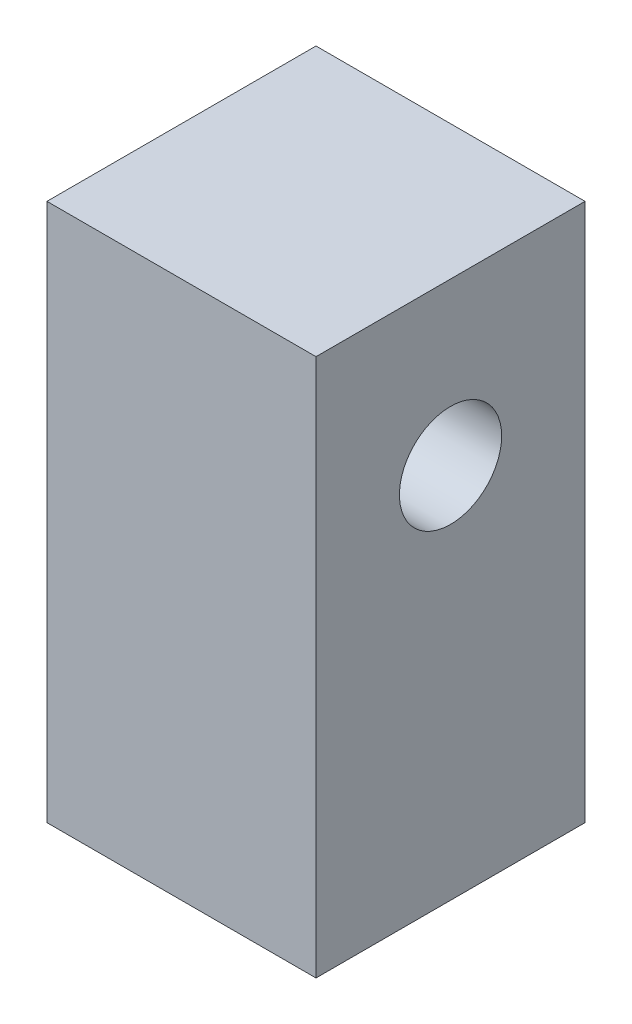
ISO-10303-21;
HEADER;
FILE_DESCRIPTION(('STEP AP214'),'2;1');
FILE_NAME('part.step','',(''),(''),'','','');
FILE_SCHEMA(('AUTOMOTIVE_DESIGN { 1 0 10303 214 1 1 1 1 }'));
ENDSEC;
DATA;
#1=APPLICATION_CONTEXT('core data for automotive mechanical design processes');
#2=APPLICATION_PROTOCOL_DEFINITION('international standard','automotive_design',2000,#1);
#3=PRODUCT_CONTEXT('',#1,'mechanical');
#4=PRODUCT('Part','Part','',(#3));
#5=PRODUCT_RELATED_PRODUCT_CATEGORY('part','',(#4));
#6=PRODUCT_DEFINITION_FORMATION('','',#4);
#7=PRODUCT_DEFINITION_CONTEXT('part definition',#1,'design');
#8=PRODUCT_DEFINITION('design','',#6,#7);
#9=PRODUCT_DEFINITION_SHAPE('','',#8);
#10=(LENGTH_UNIT() NAMED_UNIT(*) SI_UNIT(.MILLI.,.METRE.));
#11=(NAMED_UNIT(*) PLANE_ANGLE_UNIT() SI_UNIT($,.RADIAN.));
#12=(NAMED_UNIT(*) SI_UNIT($,.STERADIAN.) SOLID_ANGLE_UNIT());
#13=UNCERTAINTY_MEASURE_WITH_UNIT(LENGTH_MEASURE(1.E-05),#10,'distance_accuracy_value','');
#14=(GEOMETRIC_REPRESENTATION_CONTEXT(3) GLOBAL_UNCERTAINTY_ASSIGNED_CONTEXT((#13)) GLOBAL_UNIT_ASSIGNED_CONTEXT((#10,
#11,#12)) REPRESENTATION_CONTEXT('',''));
#15=CARTESIAN_POINT('',(0.,0.,0.));
#16=DIRECTION('',(0.,0.,1.));
#17=DIRECTION('',(1.,0.,0.));
#18=AXIS2_PLACEMENT_3D('',#15,#16,#17);
#19=CARTESIAN_POINT('',(-6.35,25.4,6.35));
#20=DIRECTION('',(1.,0.,0.));
#21=DIRECTION('',(0.,0.,-1.));
#22=AXIS2_PLACEMENT_3D('',#19,#20,#21);
#23=PLANE('',#22);
#24=CARTESIAN_POINT('',(-6.35,17.78,0.));
#25=DIRECTION('',(1.,0.,0.));
#26=DIRECTION('',(0.,0.,-1.));
#27=AXIS2_PLACEMENT_3D('',#24,#25,#26);
#28=CIRCLE('',#27,2.413);
#29=CARTESIAN_POINT('',(-6.35,17.78,-2.413));
#30=VERTEX_POINT('',#29);
#31=EDGE_CURVE('E116',#30,#30,#28,.T.);
#32=ORIENTED_EDGE('',*,*,#31,.T.);
#33=EDGE_LOOP('',(#32));
#34=FACE_BOUND('',#33,.T.);
#35=DIRECTION('',(0.,0.,1.));
#36=VECTOR('',#35,1.);
#37=CARTESIAN_POINT('',(-6.35,0.,6.35));
#38=LINE('',#37,#36);
#39=CARTESIAN_POINT('',(-6.35,0.,-6.35));
#40=VERTEX_POINT('',#39);
#41=CARTESIAN_POINT('',(-6.35,0.,6.35));
#42=VERTEX_POINT('',#41);
#43=EDGE_CURVE('E112',#40,#42,#38,.T.);
#44=ORIENTED_EDGE('',*,*,#43,.T.);
#45=DIRECTION('',(0.,-1.,0.));
#46=VECTOR('',#45,1.);
#47=CARTESIAN_POINT('',(-6.35,25.4,6.35));
#48=LINE('',#47,#46);
#49=CARTESIAN_POINT('',(-6.35,25.4,6.35));
#50=VERTEX_POINT('',#49);
#51=EDGE_CURVE('E11',#50,#42,#48,.T.);
#52=ORIENTED_EDGE('',*,*,#51,.F.);
#53=DIRECTION('',(0.,0.,1.));
#54=VECTOR('',#53,1.);
#55=CARTESIAN_POINT('',(-6.35,25.4,6.35));
#56=LINE('',#55,#54);
#57=CARTESIAN_POINT('',(-6.35,25.4,-6.35));
#58=VERTEX_POINT('',#57);
#59=EDGE_CURVE('E95',#58,#50,#56,.T.);
#60=ORIENTED_EDGE('',*,*,#59,.F.);
#61=DIRECTION('',(0.,-1.,0.));
#62=VECTOR('',#61,1.);
#63=CARTESIAN_POINT('',(-6.35,25.4,-6.35));
#64=LINE('',#63,#62);
#65=EDGE_CURVE('E108',#58,#40,#64,.T.);
#66=ORIENTED_EDGE('',*,*,#65,.T.);
#67=EDGE_LOOP('',(#44,#52,#60,#66));
#68=FACE_BOUND('',#67,.T.);
#69=ADVANCED_FACE('F43',(#34,#68),#23,.F.);
#70=CARTESIAN_POINT('',(6.35,25.4,6.35));
#71=DIRECTION('',(0.,0.,-1.));
#72=DIRECTION('',(-1.,0.,0.));
#73=AXIS2_PLACEMENT_3D('',#70,#71,#72);
#74=PLANE('',#73);
#75=DIRECTION('',(1.,0.,0.));
#76=VECTOR('',#75,1.);
#77=CARTESIAN_POINT('',(6.35,0.,6.35));
#78=LINE('',#77,#76);
#79=CARTESIAN_POINT('',(6.35,0.,6.35));
#80=VERTEX_POINT('',#79);
#81=EDGE_CURVE('E100',#42,#80,#78,.T.);
#82=ORIENTED_EDGE('',*,*,#81,.T.);
#83=DIRECTION('',(0.,-1.,0.));
#84=VECTOR('',#83,1.);
#85=CARTESIAN_POINT('',(6.35,25.4,6.35));
#86=LINE('',#85,#84);
#87=CARTESIAN_POINT('',(6.35,25.4,6.35));
#88=VERTEX_POINT('',#87);
#89=EDGE_CURVE('E52',#88,#80,#86,.T.);
#90=ORIENTED_EDGE('',*,*,#89,.F.);
#91=DIRECTION('',(1.,0.,0.));
#92=VECTOR('',#91,1.);
#93=CARTESIAN_POINT('',(6.35,25.4,6.35));
#94=LINE('',#93,#92);
#95=EDGE_CURVE('E90',#50,#88,#94,.T.);
#96=ORIENTED_EDGE('',*,*,#95,.F.);
#97=ORIENTED_EDGE('',*,*,#51,.T.);
#98=EDGE_LOOP('',(#82,#90,#96,#97));
#99=FACE_BOUND('',#98,.T.);
#100=ADVANCED_FACE('F99',(#99),#74,.F.);
#101=CARTESIAN_POINT('',(6.35,25.4,6.35));
#102=DIRECTION('',(-1.,0.,0.));
#103=DIRECTION('',(0.,0.,1.));
#104=AXIS2_PLACEMENT_3D('',#101,#102,#103);
#105=PLANE('',#104);
#106=CARTESIAN_POINT('',(6.35,17.78,0.));
#107=DIRECTION('',(1.,0.,0.));
#108=DIRECTION('',(0.,0.,-1.));
#109=AXIS2_PLACEMENT_3D('',#106,#107,#108);
#110=CIRCLE('',#109,2.413);
#111=CARTESIAN_POINT('',(6.35,17.78,-2.413));
#112=VERTEX_POINT('',#111);
#113=EDGE_CURVE('E138',#112,#112,#110,.T.);
#114=ORIENTED_EDGE('',*,*,#113,.F.);
#115=EDGE_LOOP('',(#114));
#116=FACE_BOUND('',#115,.T.);
#117=DIRECTION('',(0.,0.,-1.));
#118=VECTOR('',#117,1.);
#119=CARTESIAN_POINT('',(6.35,0.,6.35));
#120=LINE('',#119,#118);
#121=CARTESIAN_POINT('',(6.35,0.,-6.35));
#122=VERTEX_POINT('',#121);
#123=EDGE_CURVE('E77',#80,#122,#120,.T.);
#124=ORIENTED_EDGE('',*,*,#123,.T.);
#125=DIRECTION('',(0.,-1.,0.));
#126=VECTOR('',#125,1.);
#127=CARTESIAN_POINT('',(6.35,25.4,-6.35));
#128=LINE('',#127,#126);
#129=CARTESIAN_POINT('',(6.35,25.4,-6.35));
#130=VERTEX_POINT('',#129);
#131=EDGE_CURVE('E102',#130,#122,#128,.T.);
#132=ORIENTED_EDGE('',*,*,#131,.F.);
#133=DIRECTION('',(0.,0.,-1.));
#134=VECTOR('',#133,1.);
#135=CARTESIAN_POINT('',(6.35,25.4,6.35));
#136=LINE('',#135,#134);
#137=EDGE_CURVE('E93',#88,#130,#136,.T.);
#138=ORIENTED_EDGE('',*,*,#137,.F.);
#139=ORIENTED_EDGE('',*,*,#89,.T.);
#140=EDGE_LOOP('',(#124,#132,#138,#139));
#141=FACE_BOUND('',#140,.T.);
#142=ADVANCED_FACE('F103',(#116,#141),#105,.F.);
#143=CARTESIAN_POINT('',(6.35,25.4,-6.35));
#144=DIRECTION('',(0.,0.,1.));
#145=DIRECTION('',(1.,0.,0.));
#146=AXIS2_PLACEMENT_3D('',#143,#144,#145);
#147=PLANE('',#146);
#148=DIRECTION('',(-1.,0.,0.));
#149=VECTOR('',#148,1.);
#150=CARTESIAN_POINT('',(6.35,0.,-6.35));
#151=LINE('',#150,#149);
#152=EDGE_CURVE('E83',#122,#40,#151,.T.);
#153=ORIENTED_EDGE('',*,*,#152,.T.);
#154=ORIENTED_EDGE('',*,*,#65,.F.);
#155=DIRECTION('',(-1.,0.,0.));
#156=VECTOR('',#155,1.);
#157=CARTESIAN_POINT('',(6.35,25.4,-6.35));
#158=LINE('',#157,#156);
#159=EDGE_CURVE('E60',#130,#58,#158,.T.);
#160=ORIENTED_EDGE('',*,*,#159,.F.);
#161=ORIENTED_EDGE('',*,*,#131,.T.);
#162=EDGE_LOOP('',(#153,#154,#160,#161));
#163=FACE_BOUND('',#162,.T.);
#164=ADVANCED_FACE('F127',(#163),#147,.F.);
#165=CARTESIAN_POINT('',(0.,25.4,0.));
#166=DIRECTION('',(0.,1.,0.));
#167=DIRECTION('',(0.,0.,1.));
#168=AXIS2_PLACEMENT_3D('',#165,#166,#167);
#169=PLANE('',#168);
#170=ORIENTED_EDGE('',*,*,#59,.T.);
#171=ORIENTED_EDGE('',*,*,#95,.T.);
#172=ORIENTED_EDGE('',*,*,#137,.T.);
#173=ORIENTED_EDGE('',*,*,#159,.T.);
#174=EDGE_LOOP('',(#170,#171,#172,#173));
#175=FACE_BOUND('',#174,.T.);
#176=ADVANCED_FACE('F91',(#175),#169,.T.);
#177=CARTESIAN_POINT('',(0.,0.,0.));
#178=DIRECTION('',(0.,1.,0.));
#179=DIRECTION('',(0.,0.,1.));
#180=AXIS2_PLACEMENT_3D('',#177,#178,#179);
#181=PLANE('',#180);
#182=ORIENTED_EDGE('',*,*,#43,.F.);
#183=ORIENTED_EDGE('',*,*,#152,.F.);
#184=ORIENTED_EDGE('',*,*,#123,.F.);
#185=ORIENTED_EDGE('',*,*,#81,.F.);
#186=EDGE_LOOP('',(#182,#183,#184,#185));
#187=FACE_BOUND('',#186,.T.);
#188=ADVANCED_FACE('F130',(#187),#181,.F.);
#189=CARTESIAN_POINT('',(-19.05,17.78,0.));
#190=DIRECTION('',(1.,0.,0.));
#191=DIRECTION('',(0.,0.,-1.));
#192=AXIS2_PLACEMENT_3D('',#189,#190,#191);
#193=CYLINDRICAL_SURFACE('',#192,2.413);
#194=ORIENTED_EDGE('',*,*,#113,.T.);
#195=EDGE_LOOP('',(#194));
#196=FACE_BOUND('',#195,.T.);
#197=ORIENTED_EDGE('',*,*,#31,.F.);
#198=EDGE_LOOP('',(#197));
#199=FACE_BOUND('',#198,.T.);
#200=ADVANCED_FACE('F144',(#196,#199),#193,.F.);
#201=CLOSED_SHELL('',(#69,#100,#142,#164,#176,#188,#200));
#202=MANIFOLD_SOLID_BREP('B2',#201);
#203=ADVANCED_BREP_SHAPE_REPRESENTATION('',(#18,#202),#14);
#204=SHAPE_DEFINITION_REPRESENTATION(#9,#203);
ENDSEC;
END-ISO-10303-21;
